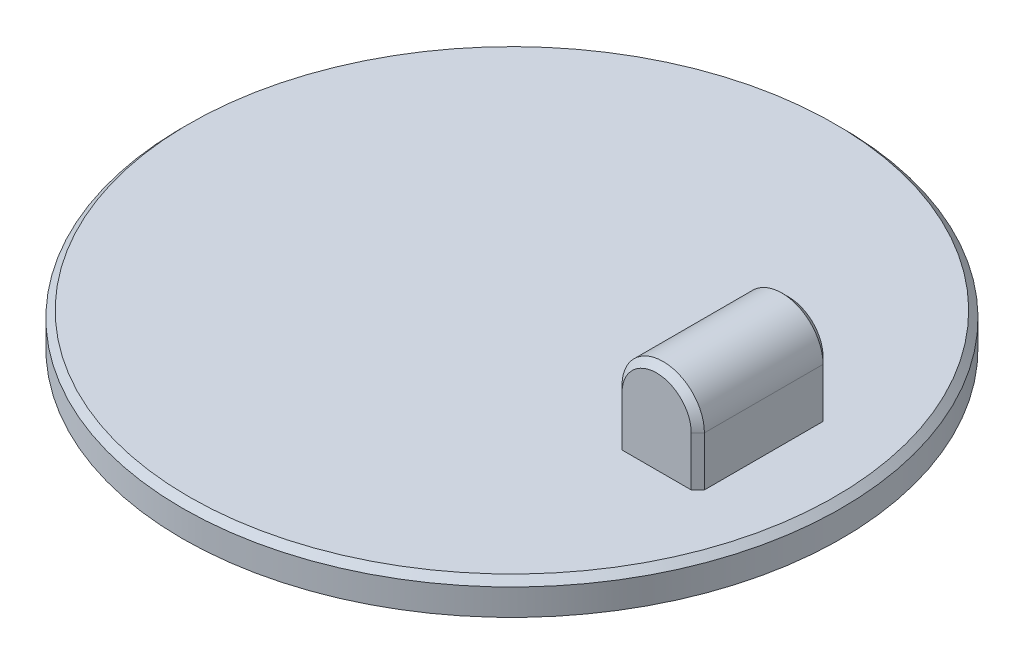
ISO-10303-21;
HEADER;
FILE_DESCRIPTION(('STEP AP214'),'2;1');
FILE_NAME('part.step','',(''),(''),'','','');
FILE_SCHEMA(('AUTOMOTIVE_DESIGN { 1 0 10303 214 1 1 1 1 }'));
ENDSEC;
DATA;
#1=APPLICATION_CONTEXT('core data for automotive mechanical design processes');
#2=APPLICATION_PROTOCOL_DEFINITION('international standard','automotive_design',2000,#1);
#3=PRODUCT_CONTEXT('',#1,'mechanical');
#4=PRODUCT('Part','Part','',(#3));
#5=PRODUCT_RELATED_PRODUCT_CATEGORY('part','',(#4));
#6=PRODUCT_DEFINITION_FORMATION('','',#4);
#7=PRODUCT_DEFINITION_CONTEXT('part definition',#1,'design');
#8=PRODUCT_DEFINITION('design','',#6,#7);
#9=PRODUCT_DEFINITION_SHAPE('','',#8);
#10=(LENGTH_UNIT() NAMED_UNIT(*) SI_UNIT(.MILLI.,.METRE.));
#11=(NAMED_UNIT(*) PLANE_ANGLE_UNIT() SI_UNIT($,.RADIAN.));
#12=(NAMED_UNIT(*) SI_UNIT($,.STERADIAN.) SOLID_ANGLE_UNIT());
#13=UNCERTAINTY_MEASURE_WITH_UNIT(LENGTH_MEASURE(1.E-05),#10,'distance_accuracy_value','');
#14=(GEOMETRIC_REPRESENTATION_CONTEXT(3) GLOBAL_UNCERTAINTY_ASSIGNED_CONTEXT((#13)) GLOBAL_UNIT_ASSIGNED_CONTEXT((#10,
#11,#12)) REPRESENTATION_CONTEXT('',''));
#15=CARTESIAN_POINT('',(0.,0.,0.));
#16=DIRECTION('',(0.,0.,1.));
#17=DIRECTION('',(1.,0.,0.));
#18=AXIS2_PLACEMENT_3D('',#15,#16,#17);
#19=CARTESIAN_POINT('',(0.,10.,0.));
#20=DIRECTION('',(0.,-1.,0.));
#21=DIRECTION('',(0.,0.,-1.));
#22=AXIS2_PLACEMENT_3D('',#19,#20,#21);
#23=CYLINDRICAL_SURFACE('',#22,100.);
#24=CARTESIAN_POINT('',(0.,7.99999999999997,0.));
#25=DIRECTION('',(0.,1.,0.));
#26=DIRECTION('',(0.,0.,1.));
#27=AXIS2_PLACEMENT_3D('',#24,#25,#26);
#28=CIRCLE('',#27,100.);
#29=CARTESIAN_POINT('',(0.,7.99999999999997,100.));
#30=VERTEX_POINT('',#29);
#31=EDGE_CURVE('E11',#30,#30,#28,.F.);
#32=ORIENTED_EDGE('',*,*,#31,.T.);
#33=EDGE_LOOP('',(#32));
#34=FACE_BOUND('',#33,.T.);
#35=CARTESIAN_POINT('',(0.,0.,0.));
#36=DIRECTION('',(0.,1.,0.));
#37=DIRECTION('',(0.,0.,1.));
#38=AXIS2_PLACEMENT_3D('',#35,#36,#37);
#39=CIRCLE('',#38,100.);
#40=CARTESIAN_POINT('',(0.,0.,100.));
#41=VERTEX_POINT('',#40);
#42=EDGE_CURVE('E138',#41,#41,#39,.T.);
#43=ORIENTED_EDGE('',*,*,#42,.T.);
#44=EDGE_LOOP('',(#43));
#45=FACE_BOUND('',#44,.T.);
#46=ADVANCED_FACE('F43',(#34,#45),#23,.T.);
#47=CARTESIAN_POINT('',(0.,10.,0.));
#48=DIRECTION('',(0.,1.,0.));
#49=DIRECTION('',(0.,0.,1.));
#50=AXIS2_PLACEMENT_3D('',#47,#48,#49);
#51=PLANE('',#50);
#52=CARTESIAN_POINT('',(0.,10.,0.));
#53=DIRECTION('',(0.,1.,0.));
#54=DIRECTION('',(0.,0.,1.));
#55=AXIS2_PLACEMENT_3D('',#52,#53,#54);
#56=CIRCLE('',#55,98.);
#57=CARTESIAN_POINT('',(0.,10.,98.));
#58=VERTEX_POINT('',#57);
#59=EDGE_CURVE('E52',#58,#58,#56,.T.);
#60=ORIENTED_EDGE('',*,*,#59,.T.);
#61=EDGE_LOOP('',(#60));
#62=FACE_BOUND('',#61,.T.);
#63=DIRECTION('',(1.,0.,0.));
#64=VECTOR('',#63,1.);
#65=CARTESIAN_POINT('',(51.3989579541874,10.,20.));
#66=LINE('',#65,#64);
#67=CARTESIAN_POINT('',(53.3989579541873,10.,20.));
#68=VERTEX_POINT('',#67);
#69=CARTESIAN_POINT('',(74.3989579541874,10.,20.));
#70=VERTEX_POINT('',#69);
#71=EDGE_CURVE('E133',#68,#70,#66,.T.);
#72=ORIENTED_EDGE('',*,*,#71,.F.);
#73=DIRECTION('',(-0.707106781186544,0.,-0.707106781186551));
#74=VECTOR('',#73,1.);
#75=CARTESIAN_POINT('',(53.3989579541873,10.,20.));
#76=LINE('',#75,#74);
#77=CARTESIAN_POINT('',(51.3989579541874,10.,18.));
#78=VERTEX_POINT('',#77);
#79=EDGE_CURVE('E149',#68,#78,#76,.T.);
#80=ORIENTED_EDGE('',*,*,#79,.T.);
#81=DIRECTION('',(0.,0.,-1.));
#82=VECTOR('',#81,1.);
#83=CARTESIAN_POINT('',(51.3989579541874,10.,20.));
#84=LINE('',#83,#82);
#85=CARTESIAN_POINT('',(51.3989579541874,10.,-18.));
#86=VERTEX_POINT('',#85);
#87=EDGE_CURVE('E178',#78,#86,#84,.T.);
#88=ORIENTED_EDGE('',*,*,#87,.T.);
#89=DIRECTION('',(-0.70710678118655,0.,0.707106781186545));
#90=VECTOR('',#89,1.);
#91=CARTESIAN_POINT('',(51.3989579541874,10.,-18.));
#92=LINE('',#91,#90);
#93=CARTESIAN_POINT('',(53.3989579541874,10.,-20.));
#94=VERTEX_POINT('',#93);
#95=EDGE_CURVE('E158',#86,#94,#92,.F.);
#96=ORIENTED_EDGE('',*,*,#95,.T.);
#97=DIRECTION('',(1.,0.,0.));
#98=VECTOR('',#97,1.);
#99=CARTESIAN_POINT('',(51.3989579541874,10.,-20.));
#100=LINE('',#99,#98);
#101=CARTESIAN_POINT('',(74.3989579541874,10.,-20.));
#102=VERTEX_POINT('',#101);
#103=EDGE_CURVE('E166',#94,#102,#100,.T.);
#104=ORIENTED_EDGE('',*,*,#103,.T.);
#105=DIRECTION('',(-0.70710678118655,0.,-0.707106781186545));
#106=VECTOR('',#105,1.);
#107=CARTESIAN_POINT('',(76.3989579541874,10.,-18.));
#108=LINE('',#107,#106);
#109=CARTESIAN_POINT('',(76.3989579541874,10.,-18.));
#110=VERTEX_POINT('',#109);
#111=EDGE_CURVE('E199',#102,#110,#108,.F.);
#112=ORIENTED_EDGE('',*,*,#111,.T.);
#113=DIRECTION('',(0.,0.,-1.));
#114=VECTOR('',#113,1.);
#115=CARTESIAN_POINT('',(76.3989579541874,10.,20.));
#116=LINE('',#115,#114);
#117=CARTESIAN_POINT('',(76.3989579541874,10.,18.));
#118=VERTEX_POINT('',#117);
#119=EDGE_CURVE('E132',#118,#110,#116,.T.);
#120=ORIENTED_EDGE('',*,*,#119,.F.);
#121=DIRECTION('',(-0.707106781186544,0.,0.707106781186551));
#122=VECTOR('',#121,1.);
#123=CARTESIAN_POINT('',(74.3989579541874,10.,20.));
#124=LINE('',#123,#122);
#125=EDGE_CURVE('E137',#118,#70,#124,.T.);
#126=ORIENTED_EDGE('',*,*,#125,.T.);
#127=EDGE_LOOP('',(#72,#80,#88,#96,#104,#112,#120,#126));
#128=FACE_BOUND('',#127,.T.);
#129=ADVANCED_FACE('F201',(#62,#128),#51,.T.);
#130=CARTESIAN_POINT('',(0.,0.,0.));
#131=DIRECTION('',(0.,1.,0.));
#132=DIRECTION('',(0.,0.,1.));
#133=AXIS2_PLACEMENT_3D('',#130,#131,#132);
#134=PLANE('',#133);
#135=ORIENTED_EDGE('',*,*,#42,.F.);
#136=EDGE_LOOP('',(#135));
#137=FACE_BOUND('',#136,.T.);
#138=ADVANCED_FACE('F223',(#137),#134,.F.);
#139=CARTESIAN_POINT('',(63.8989579541874,25.,20.));
#140=DIRECTION('',(0.,0.,-1.));
#141=DIRECTION('',(-1.,0.,0.));
#142=AXIS2_PLACEMENT_3D('',#139,#140,#141);
#143=CYLINDRICAL_SURFACE('',#142,12.5);
#144=DIRECTION('',(0.,0.,-1.));
#145=VECTOR('',#144,1.);
#146=CARTESIAN_POINT('',(76.3989579541874,25.,20.));
#147=LINE('',#146,#145);
#148=CARTESIAN_POINT('',(76.3989579541874,25.,18.));
#149=VERTEX_POINT('',#148);
#150=CARTESIAN_POINT('',(76.3989579541874,25.,-18.));
#151=VERTEX_POINT('',#150);
#152=EDGE_CURVE('E115',#149,#151,#147,.T.);
#153=ORIENTED_EDGE('',*,*,#152,.T.);
#154=CARTESIAN_POINT('',(63.8989579541874,25.,-18.));
#155=DIRECTION('',(0.,0.,1.));
#156=DIRECTION('',(1.,0.,0.));
#157=AXIS2_PLACEMENT_3D('',#154,#155,#156);
#158=CIRCLE('',#157,12.5);
#159=CARTESIAN_POINT('',(51.3989579541874,25.,-18.));
#160=VERTEX_POINT('',#159);
#161=EDGE_CURVE('E121',#151,#160,#158,.T.);
#162=ORIENTED_EDGE('',*,*,#161,.T.);
#163=DIRECTION('',(0.,0.,-1.));
#164=VECTOR('',#163,1.);
#165=CARTESIAN_POINT('',(51.3989579541874,25.,20.));
#166=LINE('',#165,#164);
#167=CARTESIAN_POINT('',(51.3989579541874,25.,18.));
#168=VERTEX_POINT('',#167);
#169=EDGE_CURVE('E117',#168,#160,#166,.T.);
#170=ORIENTED_EDGE('',*,*,#169,.F.);
#171=CARTESIAN_POINT('',(63.8989579541874,25.,18.));
#172=DIRECTION('',(0.,0.,1.));
#173=DIRECTION('',(1.,0.,0.));
#174=AXIS2_PLACEMENT_3D('',#171,#172,#173);
#175=CIRCLE('',#174,12.5);
#176=EDGE_CURVE('E112',#168,#149,#175,.F.);
#177=ORIENTED_EDGE('',*,*,#176,.T.);
#178=EDGE_LOOP('',(#153,#162,#170,#177));
#179=FACE_BOUND('',#178,.T.);
#180=ADVANCED_FACE('F114',(#179),#143,.T.);
#181=CARTESIAN_POINT('',(51.3989579541874,25.,20.));
#182=DIRECTION('',(1.,0.,0.));
#183=DIRECTION('',(0.,0.,-1.));
#184=AXIS2_PLACEMENT_3D('',#181,#182,#183);
#185=PLANE('',#184);
#186=ORIENTED_EDGE('',*,*,#169,.T.);
#187=DIRECTION('',(0.,-1.,0.));
#188=VECTOR('',#187,1.);
#189=CARTESIAN_POINT('',(51.3989579541874,25.,-18.));
#190=LINE('',#189,#188);
#191=EDGE_CURVE('E122',#160,#86,#190,.T.);
#192=ORIENTED_EDGE('',*,*,#191,.T.);
#193=ORIENTED_EDGE('',*,*,#87,.F.);
#194=DIRECTION('',(0.,1.,0.));
#195=VECTOR('',#194,1.);
#196=CARTESIAN_POINT('',(51.3989579541874,25.,18.));
#197=LINE('',#196,#195);
#198=EDGE_CURVE('E190',#78,#168,#197,.T.);
#199=ORIENTED_EDGE('',*,*,#198,.T.);
#200=EDGE_LOOP('',(#186,#192,#193,#199));
#201=FACE_BOUND('',#200,.T.);
#202=ADVANCED_FACE('F215',(#201),#185,.F.);
#203=CARTESIAN_POINT('',(76.3989579541874,25.,20.));
#204=DIRECTION('',(-1.,0.,0.));
#205=DIRECTION('',(0.,0.,1.));
#206=AXIS2_PLACEMENT_3D('',#203,#204,#205);
#207=PLANE('',#206);
#208=ORIENTED_EDGE('',*,*,#119,.T.);
#209=DIRECTION('',(0.,1.,0.));
#210=VECTOR('',#209,1.);
#211=CARTESIAN_POINT('',(76.3989579541874,25.,-18.));
#212=LINE('',#211,#210);
#213=EDGE_CURVE('E131',#110,#151,#212,.T.);
#214=ORIENTED_EDGE('',*,*,#213,.T.);
#215=ORIENTED_EDGE('',*,*,#152,.F.);
#216=DIRECTION('',(0.,-1.,0.));
#217=VECTOR('',#216,1.);
#218=CARTESIAN_POINT('',(76.3989579541874,10.,18.));
#219=LINE('',#218,#217);
#220=EDGE_CURVE('E128',#149,#118,#219,.T.);
#221=ORIENTED_EDGE('',*,*,#220,.T.);
#222=EDGE_LOOP('',(#208,#214,#215,#221));
#223=FACE_BOUND('',#222,.T.);
#224=ADVANCED_FACE('F127',(#223),#207,.F.);
#225=CARTESIAN_POINT('',(63.8989579541874,25.,20.));
#226=DIRECTION('',(0.,0.,1.));
#227=DIRECTION('',(1.,0.,0.));
#228=AXIS2_PLACEMENT_3D('',#225,#226,#227);
#229=PLANE('',#228);
#230=ORIENTED_EDGE('',*,*,#71,.T.);
#231=DIRECTION('',(0.,1.,0.));
#232=VECTOR('',#231,1.);
#233=CARTESIAN_POINT('',(74.3989579541874,25.,20.));
#234=LINE('',#233,#232);
#235=CARTESIAN_POINT('',(74.3989579541874,25.,20.));
#236=VERTEX_POINT('',#235);
#237=EDGE_CURVE('E197',#70,#236,#234,.T.);
#238=ORIENTED_EDGE('',*,*,#237,.T.);
#239=CARTESIAN_POINT('',(63.8989579541874,25.,20.));
#240=DIRECTION('',(0.,0.,1.));
#241=DIRECTION('',(1.,0.,0.));
#242=AXIS2_PLACEMENT_3D('',#239,#240,#241);
#243=CIRCLE('',#242,10.5);
#244=CARTESIAN_POINT('',(53.3989579541873,25.,20.));
#245=VERTEX_POINT('',#244);
#246=EDGE_CURVE('E59',#236,#245,#243,.T.);
#247=ORIENTED_EDGE('',*,*,#246,.T.);
#248=DIRECTION('',(0.,-1.,0.));
#249=VECTOR('',#248,1.);
#250=CARTESIAN_POINT('',(53.3989579541873,10.,20.));
#251=LINE('',#250,#249);
#252=EDGE_CURVE('E195',#245,#68,#251,.T.);
#253=ORIENTED_EDGE('',*,*,#252,.T.);
#254=EDGE_LOOP('',(#230,#238,#247,#253));
#255=FACE_BOUND('',#254,.T.);
#256=ADVANCED_FACE('F210',(#255),#229,.T.);
#257=CARTESIAN_POINT('',(63.8989579541874,25.,-20.));
#258=DIRECTION('',(0.,0.,1.));
#259=DIRECTION('',(1.,0.,0.));
#260=AXIS2_PLACEMENT_3D('',#257,#258,#259);
#261=PLANE('',#260);
#262=CARTESIAN_POINT('',(63.8989579541874,25.,-20.));
#263=DIRECTION('',(0.,0.,1.));
#264=DIRECTION('',(1.,0.,0.));
#265=AXIS2_PLACEMENT_3D('',#262,#263,#264);
#266=CIRCLE('',#265,10.5);
#267=CARTESIAN_POINT('',(53.3989579541874,25.,-20.));
#268=VERTEX_POINT('',#267);
#269=CARTESIAN_POINT('',(74.3989579541874,25.,-20.));
#270=VERTEX_POINT('',#269);
#271=EDGE_CURVE('E184',#268,#270,#266,.F.);
#272=ORIENTED_EDGE('',*,*,#271,.T.);
#273=DIRECTION('',(0.,-1.,0.));
#274=VECTOR('',#273,1.);
#275=CARTESIAN_POINT('',(74.3989579541874,25.,-20.));
#276=LINE('',#275,#274);
#277=EDGE_CURVE('E188',#270,#102,#276,.T.);
#278=ORIENTED_EDGE('',*,*,#277,.T.);
#279=ORIENTED_EDGE('',*,*,#103,.F.);
#280=DIRECTION('',(0.,1.,0.));
#281=VECTOR('',#280,1.);
#282=CARTESIAN_POINT('',(53.3989579541874,25.,-20.));
#283=LINE('',#282,#281);
#284=EDGE_CURVE('E186',#94,#268,#283,.T.);
#285=ORIENTED_EDGE('',*,*,#284,.T.);
#286=EDGE_LOOP('',(#272,#278,#279,#285));
#287=FACE_BOUND('',#286,.T.);
#288=ADVANCED_FACE('F206',(#287),#261,.F.);
#289=CARTESIAN_POINT('',(51.3989579541874,25.,-18.));
#290=DIRECTION('',(0.707106781186545,0.,0.70710678118655));
#291=DIRECTION('',(0.,-1.,0.));
#292=AXIS2_PLACEMENT_3D('',#289,#290,#291);
#293=PLANE('',#292);
#294=ORIENTED_EDGE('',*,*,#95,.F.);
#295=ORIENTED_EDGE('',*,*,#191,.F.);
#296=DIRECTION('',(-0.70710678118655,0.,0.707106781186545));
#297=VECTOR('',#296,1.);
#298=CARTESIAN_POINT('',(53.3989579541874,25.,-20.));
#299=LINE('',#298,#297);
#300=EDGE_CURVE('E146',#268,#160,#299,.T.);
#301=ORIENTED_EDGE('',*,*,#300,.F.);
#302=ORIENTED_EDGE('',*,*,#284,.F.);
#303=EDGE_LOOP('',(#294,#295,#301,#302));
#304=FACE_BOUND('',#303,.T.);
#305=ADVANCED_FACE('F207',(#304),#293,.F.);
#306=CARTESIAN_POINT('',(63.8989579541874,25.,-18.));
#307=DIRECTION('',(0.,0.,1.));
#308=DIRECTION('',(1.,0.,0.));
#309=AXIS2_PLACEMENT_3D('',#306,#307,#308);
#310=CONICAL_SURFACE('',#309,12.5,0.785398163397453);
#311=ORIENTED_EDGE('',*,*,#300,.T.);
#312=ORIENTED_EDGE('',*,*,#161,.F.);
#313=DIRECTION('',(0.70710678118655,0.,0.707106781186545));
#314=VECTOR('',#313,1.);
#315=CARTESIAN_POINT('',(74.3989579541874,25.,-20.));
#316=LINE('',#315,#314);
#317=EDGE_CURVE('E143',#270,#151,#316,.T.);
#318=ORIENTED_EDGE('',*,*,#317,.F.);
#319=ORIENTED_EDGE('',*,*,#271,.F.);
#320=EDGE_LOOP('',(#311,#312,#318,#319));
#321=FACE_BOUND('',#320,.T.);
#322=ADVANCED_FACE('F208',(#321),#310,.T.);
#323=CARTESIAN_POINT('',(76.3989579541874,25.,-18.));
#324=DIRECTION('',(-0.707106781186545,0.,0.70710678118655));
#325=DIRECTION('',(0.,1.,0.));
#326=AXIS2_PLACEMENT_3D('',#323,#324,#325);
#327=PLANE('',#326);
#328=ORIENTED_EDGE('',*,*,#111,.F.);
#329=ORIENTED_EDGE('',*,*,#277,.F.);
#330=ORIENTED_EDGE('',*,*,#317,.T.);
#331=ORIENTED_EDGE('',*,*,#213,.F.);
#332=EDGE_LOOP('',(#328,#329,#330,#331));
#333=FACE_BOUND('',#332,.T.);
#334=ADVANCED_FACE('F209',(#333),#327,.F.);
#335=CARTESIAN_POINT('',(53.3989579541873,25.,20.));
#336=DIRECTION('',(-0.707106781186551,0.,0.707106781186544));
#337=DIRECTION('',(0.,1.,0.));
#338=AXIS2_PLACEMENT_3D('',#335,#336,#337);
#339=PLANE('',#338);
#340=ORIENTED_EDGE('',*,*,#79,.F.);
#341=ORIENTED_EDGE('',*,*,#252,.F.);
#342=DIRECTION('',(0.707106781186544,0.,0.707106781186551));
#343=VECTOR('',#342,1.);
#344=CARTESIAN_POINT('',(51.3989579541874,25.,18.));
#345=LINE('',#344,#343);
#346=EDGE_CURVE('E141',#168,#245,#345,.T.);
#347=ORIENTED_EDGE('',*,*,#346,.F.);
#348=ORIENTED_EDGE('',*,*,#198,.F.);
#349=EDGE_LOOP('',(#340,#341,#347,#348));
#350=FACE_BOUND('',#349,.T.);
#351=ADVANCED_FACE('F212',(#350),#339,.T.);
#352=CARTESIAN_POINT('',(63.8989579541874,25.,20.));
#353=DIRECTION('',(0.,0.,-1.));
#354=DIRECTION('',(-1.,0.,0.));
#355=AXIS2_PLACEMENT_3D('',#352,#353,#354);
#356=CONICAL_SURFACE('',#355,10.5,0.785398163397442);
#357=ORIENTED_EDGE('',*,*,#346,.T.);
#358=ORIENTED_EDGE('',*,*,#246,.F.);
#359=DIRECTION('',(-0.707106781186544,0.,0.707106781186551));
#360=VECTOR('',#359,1.);
#361=CARTESIAN_POINT('',(76.3989579541874,25.,18.));
#362=LINE('',#361,#360);
#363=EDGE_CURVE('E67',#149,#236,#362,.T.);
#364=ORIENTED_EDGE('',*,*,#363,.F.);
#365=ORIENTED_EDGE('',*,*,#176,.F.);
#366=EDGE_LOOP('',(#357,#358,#364,#365));
#367=FACE_BOUND('',#366,.T.);
#368=ADVANCED_FACE('F140',(#367),#356,.T.);
#369=CARTESIAN_POINT('',(74.3989579541874,25.,20.));
#370=DIRECTION('',(0.707106781186551,0.,0.707106781186544));
#371=DIRECTION('',(0.,-1.,0.));
#372=AXIS2_PLACEMENT_3D('',#369,#370,#371);
#373=PLANE('',#372);
#374=ORIENTED_EDGE('',*,*,#125,.F.);
#375=ORIENTED_EDGE('',*,*,#220,.F.);
#376=ORIENTED_EDGE('',*,*,#363,.T.);
#377=ORIENTED_EDGE('',*,*,#237,.F.);
#378=EDGE_LOOP('',(#374,#375,#376,#377));
#379=FACE_BOUND('',#378,.T.);
#380=ADVANCED_FACE('F136',(#379),#373,.T.);
#381=CARTESIAN_POINT('',(0.,10.,0.));
#382=DIRECTION('',(0.,-1.,0.));
#383=DIRECTION('',(0.,0.,-1.));
#384=AXIS2_PLACEMENT_3D('',#381,#382,#383);
#385=CONICAL_SURFACE('',#384,98.,0.785398163397438);
#386=ORIENTED_EDGE('',*,*,#31,.F.);
#387=EDGE_LOOP('',(#386));
#388=FACE_BOUND('',#387,.T.);
#389=ORIENTED_EDGE('',*,*,#59,.F.);
#390=EDGE_LOOP('',(#389));
#391=FACE_BOUND('',#390,.T.);
#392=ADVANCED_FACE('F46',(#388,#391),#385,.T.);
#393=CLOSED_SHELL('',(#46,#129,#138,#180,#202,#224,#256,#288,#305,#322,#334,#351,#368,#380,#392));
#394=MANIFOLD_SOLID_BREP('B2',#393);
#395=ADVANCED_BREP_SHAPE_REPRESENTATION('',(#18,#394),#14);
#396=SHAPE_DEFINITION_REPRESENTATION(#9,#395);
ENDSEC;
END-ISO-10303-21;
